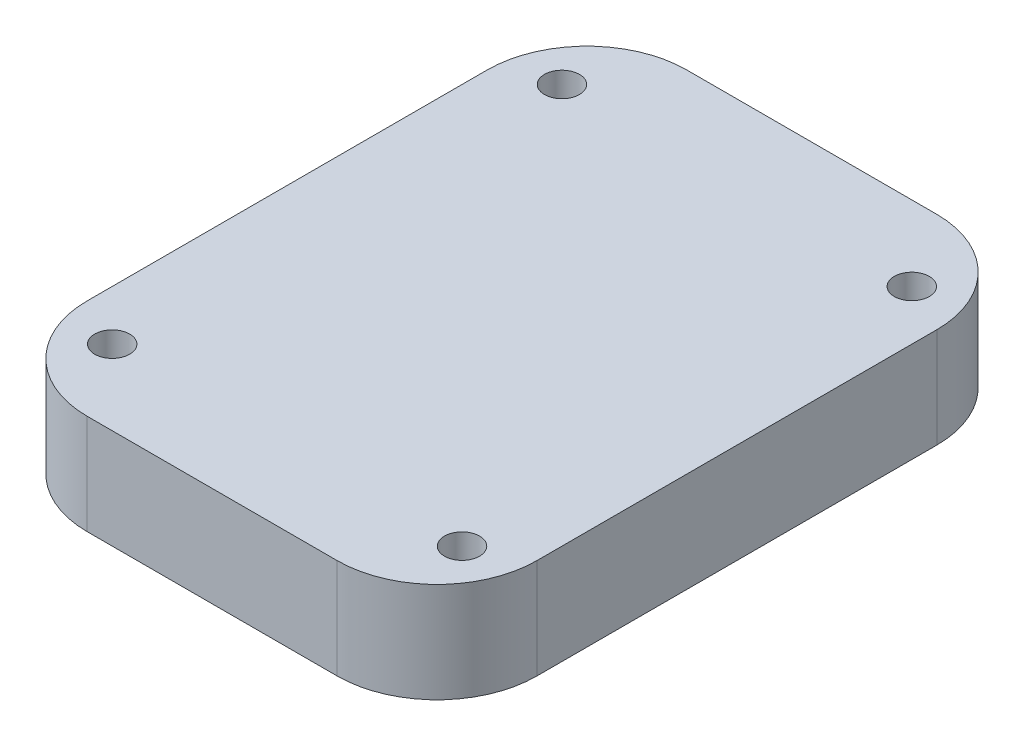
ISO-10303-21;
HEADER;
FILE_DESCRIPTION(('STEP AP214'),'2;1');
FILE_NAME('part.step','',(''),(''),'','','');
FILE_SCHEMA(('AUTOMOTIVE_DESIGN { 1 0 10303 214 1 1 1 1 }'));
ENDSEC;
DATA;
#1=APPLICATION_CONTEXT('core data for automotive mechanical design processes');
#2=APPLICATION_PROTOCOL_DEFINITION('international standard','automotive_design',2000,#1);
#3=PRODUCT_CONTEXT('',#1,'mechanical');
#4=PRODUCT('Part','Part','',(#3));
#5=PRODUCT_RELATED_PRODUCT_CATEGORY('part','',(#4));
#6=PRODUCT_DEFINITION_FORMATION('','',#4);
#7=PRODUCT_DEFINITION_CONTEXT('part definition',#1,'design');
#8=PRODUCT_DEFINITION('design','',#6,#7);
#9=PRODUCT_DEFINITION_SHAPE('','',#8);
#10=(LENGTH_UNIT() NAMED_UNIT(*) SI_UNIT(.MILLI.,.METRE.));
#11=(NAMED_UNIT(*) PLANE_ANGLE_UNIT() SI_UNIT($,.RADIAN.));
#12=(NAMED_UNIT(*) SI_UNIT($,.STERADIAN.) SOLID_ANGLE_UNIT());
#13=UNCERTAINTY_MEASURE_WITH_UNIT(LENGTH_MEASURE(1.E-05),#10,'distance_accuracy_value','');
#14=(GEOMETRIC_REPRESENTATION_CONTEXT(3) GLOBAL_UNCERTAINTY_ASSIGNED_CONTEXT((#13)) GLOBAL_UNIT_ASSIGNED_CONTEXT((#10,
#11,#12)) REPRESENTATION_CONTEXT('',''));
#15=CARTESIAN_POINT('',(0.,0.,0.));
#16=DIRECTION('',(0.,0.,1.));
#17=DIRECTION('',(1.,0.,0.));
#18=AXIS2_PLACEMENT_3D('',#15,#16,#17);
#19=CARTESIAN_POINT('',(-12.5,10.,-20.));
#20=DIRECTION('',(0.,-1.,0.));
#21=DIRECTION('',(0.,0.,-1.));
#22=AXIS2_PLACEMENT_3D('',#19,#20,#21);
#23=CYLINDRICAL_SURFACE('',#22,10.);
#24=CARTESIAN_POINT('',(-12.5,0.,-20.));
#25=DIRECTION('',(0.,1.,0.));
#26=DIRECTION('',(0.,0.,1.));
#27=AXIS2_PLACEMENT_3D('',#24,#25,#26);
#28=CIRCLE('',#27,10.);
#29=CARTESIAN_POINT('',(-12.4999999999999,0.,-30.));
#30=VERTEX_POINT('',#29);
#31=CARTESIAN_POINT('',(-22.5,0.,-19.9999999999999));
#32=VERTEX_POINT('',#31);
#33=EDGE_CURVE('E129',#30,#32,#28,.T.);
#34=ORIENTED_EDGE('',*,*,#33,.T.);
#35=DIRECTION('',(0.,-1.,0.));
#36=VECTOR('',#35,1.);
#37=CARTESIAN_POINT('',(-22.5,10.,-19.9999999999999));
#38=LINE('',#37,#36);
#39=CARTESIAN_POINT('',(-22.5,10.,-19.9999999999999));
#40=VERTEX_POINT('',#39);
#41=EDGE_CURVE('E11',#40,#32,#38,.T.);
#42=ORIENTED_EDGE('',*,*,#41,.F.);
#43=CARTESIAN_POINT('',(-12.5,10.,-20.));
#44=DIRECTION('',(0.,1.,0.));
#45=DIRECTION('',(0.,0.,1.));
#46=AXIS2_PLACEMENT_3D('',#43,#44,#45);
#47=CIRCLE('',#46,10.);
#48=CARTESIAN_POINT('',(-12.4999999999999,10.,-30.));
#49=VERTEX_POINT('',#48);
#50=EDGE_CURVE('E147',#49,#40,#47,.T.);
#51=ORIENTED_EDGE('',*,*,#50,.F.);
#52=DIRECTION('',(0.,-1.,0.));
#53=VECTOR('',#52,1.);
#54=CARTESIAN_POINT('',(-12.4999999999999,10.,-30.));
#55=LINE('',#54,#53);
#56=EDGE_CURVE('E49',#49,#30,#55,.T.);
#57=ORIENTED_EDGE('',*,*,#56,.T.);
#58=EDGE_LOOP('',(#34,#42,#51,#57));
#59=FACE_BOUND('',#58,.T.);
#60=ADVANCED_FACE('F33',(#59),#23,.T.);
#61=CARTESIAN_POINT('',(-22.5,10.,-19.9999999999999));
#62=DIRECTION('',(1.,0.,0.));
#63=DIRECTION('',(0.,0.,-1.));
#64=AXIS2_PLACEMENT_3D('',#61,#62,#63);
#65=PLANE('',#64);
#66=DIRECTION('',(0.,0.,1.));
#67=VECTOR('',#66,1.);
#68=CARTESIAN_POINT('',(-22.5,0.,-19.9999999999999));
#69=LINE('',#68,#67);
#70=CARTESIAN_POINT('',(-22.5,0.,19.9999999999999));
#71=VERTEX_POINT('',#70);
#72=EDGE_CURVE('E131',#32,#71,#69,.T.);
#73=ORIENTED_EDGE('',*,*,#72,.T.);
#74=DIRECTION('',(0.,-1.,0.));
#75=VECTOR('',#74,1.);
#76=CARTESIAN_POINT('',(-22.5,10.,19.9999999999999));
#77=LINE('',#76,#75);
#78=CARTESIAN_POINT('',(-22.5,10.,19.9999999999999));
#79=VERTEX_POINT('',#78);
#80=EDGE_CURVE('E41',#79,#71,#77,.T.);
#81=ORIENTED_EDGE('',*,*,#80,.F.);
#82=DIRECTION('',(0.,0.,1.));
#83=VECTOR('',#82,1.);
#84=CARTESIAN_POINT('',(-22.5,10.,-19.9999999999999));
#85=LINE('',#84,#83);
#86=EDGE_CURVE('E87',#40,#79,#85,.T.);
#87=ORIENTED_EDGE('',*,*,#86,.F.);
#88=ORIENTED_EDGE('',*,*,#41,.T.);
#89=EDGE_LOOP('',(#73,#81,#87,#88));
#90=FACE_BOUND('',#89,.T.);
#91=ADVANCED_FACE('F232',(#90),#65,.F.);
#92=CARTESIAN_POINT('',(-12.5,10.,20.));
#93=DIRECTION('',(0.,-1.,0.));
#94=DIRECTION('',(0.,0.,-1.));
#95=AXIS2_PLACEMENT_3D('',#92,#93,#94);
#96=CYLINDRICAL_SURFACE('',#95,10.);
#97=CARTESIAN_POINT('',(-12.5,0.,20.));
#98=DIRECTION('',(0.,1.,0.));
#99=DIRECTION('',(0.,0.,1.));
#100=AXIS2_PLACEMENT_3D('',#97,#98,#99);
#101=CIRCLE('',#100,10.);
#102=CARTESIAN_POINT('',(-12.5,0.,30.));
#103=VERTEX_POINT('',#102);
#104=EDGE_CURVE('E134',#71,#103,#101,.T.);
#105=ORIENTED_EDGE('',*,*,#104,.T.);
#106=DIRECTION('',(0.,-1.,0.));
#107=VECTOR('',#106,1.);
#108=CARTESIAN_POINT('',(-12.5,10.,30.));
#109=LINE('',#108,#107);
#110=CARTESIAN_POINT('',(-12.5,10.,30.));
#111=VERTEX_POINT('',#110);
#112=EDGE_CURVE('E154',#111,#103,#109,.T.);
#113=ORIENTED_EDGE('',*,*,#112,.F.);
#114=CARTESIAN_POINT('',(-12.5,10.,20.));
#115=DIRECTION('',(0.,1.,0.));
#116=DIRECTION('',(0.,0.,1.));
#117=AXIS2_PLACEMENT_3D('',#114,#115,#116);
#118=CIRCLE('',#117,10.);
#119=EDGE_CURVE('E162',#79,#111,#118,.T.);
#120=ORIENTED_EDGE('',*,*,#119,.F.);
#121=ORIENTED_EDGE('',*,*,#80,.T.);
#122=EDGE_LOOP('',(#105,#113,#120,#121));
#123=FACE_BOUND('',#122,.T.);
#124=ADVANCED_FACE('F160',(#123),#96,.T.);
#125=CARTESIAN_POINT('',(-12.4999999999999,10.,30.));
#126=DIRECTION('',(0.,0.,-1.));
#127=DIRECTION('',(-1.,0.,0.));
#128=AXIS2_PLACEMENT_3D('',#125,#126,#127);
#129=PLANE('',#128);
#130=DIRECTION('',(1.,0.,0.));
#131=VECTOR('',#130,1.);
#132=CARTESIAN_POINT('',(-12.4999999999999,0.,30.));
#133=LINE('',#132,#131);
#134=CARTESIAN_POINT('',(12.4999999999999,0.,30.));
#135=VERTEX_POINT('',#134);
#136=EDGE_CURVE('E136',#103,#135,#133,.T.);
#137=ORIENTED_EDGE('',*,*,#136,.T.);
#138=DIRECTION('',(0.,-1.,0.));
#139=VECTOR('',#138,1.);
#140=CARTESIAN_POINT('',(12.4999999999999,10.,30.));
#141=LINE('',#140,#139);
#142=CARTESIAN_POINT('',(12.4999999999999,10.,30.));
#143=VERTEX_POINT('',#142);
#144=EDGE_CURVE('E151',#143,#135,#141,.T.);
#145=ORIENTED_EDGE('',*,*,#144,.F.);
#146=DIRECTION('',(1.,0.,0.));
#147=VECTOR('',#146,1.);
#148=CARTESIAN_POINT('',(-12.4999999999999,10.,30.));
#149=LINE('',#148,#147);
#150=EDGE_CURVE('E173',#111,#143,#149,.T.);
#151=ORIENTED_EDGE('',*,*,#150,.F.);
#152=ORIENTED_EDGE('',*,*,#112,.T.);
#153=EDGE_LOOP('',(#137,#145,#151,#152));
#154=FACE_BOUND('',#153,.T.);
#155=ADVANCED_FACE('F169',(#154),#129,.F.);
#156=CARTESIAN_POINT('',(12.5,10.,20.));
#157=DIRECTION('',(0.,-1.,0.));
#158=DIRECTION('',(0.,0.,-1.));
#159=AXIS2_PLACEMENT_3D('',#156,#157,#158);
#160=CYLINDRICAL_SURFACE('',#159,10.);
#161=CARTESIAN_POINT('',(12.5,0.,20.));
#162=DIRECTION('',(0.,1.,0.));
#163=DIRECTION('',(0.,0.,1.));
#164=AXIS2_PLACEMENT_3D('',#161,#162,#163);
#165=CIRCLE('',#164,10.);
#166=CARTESIAN_POINT('',(22.5,0.,19.9999999999999));
#167=VERTEX_POINT('',#166);
#168=EDGE_CURVE('E138',#135,#167,#165,.T.);
#169=ORIENTED_EDGE('',*,*,#168,.T.);
#170=DIRECTION('',(0.,-1.,0.));
#171=VECTOR('',#170,1.);
#172=CARTESIAN_POINT('',(22.5,10.,19.9999999999999));
#173=LINE('',#172,#171);
#174=CARTESIAN_POINT('',(22.5,10.,19.9999999999999));
#175=VERTEX_POINT('',#174);
#176=EDGE_CURVE('E112',#175,#167,#173,.T.);
#177=ORIENTED_EDGE('',*,*,#176,.F.);
#178=CARTESIAN_POINT('',(12.5,10.,20.));
#179=DIRECTION('',(0.,1.,0.));
#180=DIRECTION('',(0.,0.,1.));
#181=AXIS2_PLACEMENT_3D('',#178,#179,#180);
#182=CIRCLE('',#181,10.);
#183=EDGE_CURVE('E120',#143,#175,#182,.T.);
#184=ORIENTED_EDGE('',*,*,#183,.F.);
#185=ORIENTED_EDGE('',*,*,#144,.T.);
#186=EDGE_LOOP('',(#169,#177,#184,#185));
#187=FACE_BOUND('',#186,.T.);
#188=ADVANCED_FACE('F172',(#187),#160,.T.);
#189=CARTESIAN_POINT('',(22.5,10.,-19.9999999999999));
#190=DIRECTION('',(1.,0.,0.));
#191=DIRECTION('',(0.,0.,-1.));
#192=AXIS2_PLACEMENT_3D('',#189,#190,#191);
#193=PLANE('',#192);
#194=DIRECTION('',(0.,0.,1.));
#195=VECTOR('',#194,1.);
#196=CARTESIAN_POINT('',(22.5,0.,-19.9999999999999));
#197=LINE('',#196,#195);
#198=CARTESIAN_POINT('',(22.5,0.,-19.9999999999999));
#199=VERTEX_POINT('',#198);
#200=EDGE_CURVE('E108',#199,#167,#197,.T.);
#201=ORIENTED_EDGE('',*,*,#200,.F.);
#202=DIRECTION('',(0.,-1.,0.));
#203=VECTOR('',#202,1.);
#204=CARTESIAN_POINT('',(22.5,10.,-19.9999999999999));
#205=LINE('',#204,#203);
#206=CARTESIAN_POINT('',(22.5,10.,-19.9999999999999));
#207=VERTEX_POINT('',#206);
#208=EDGE_CURVE('E103',#207,#199,#205,.T.);
#209=ORIENTED_EDGE('',*,*,#208,.F.);
#210=DIRECTION('',(0.,0.,1.));
#211=VECTOR('',#210,1.);
#212=CARTESIAN_POINT('',(22.5,10.,-19.9999999999999));
#213=LINE('',#212,#211);
#214=EDGE_CURVE('E106',#207,#175,#213,.T.);
#215=ORIENTED_EDGE('',*,*,#214,.T.);
#216=ORIENTED_EDGE('',*,*,#176,.T.);
#217=EDGE_LOOP('',(#201,#209,#215,#216));
#218=FACE_BOUND('',#217,.T.);
#219=ADVANCED_FACE('F105',(#218),#193,.T.);
#220=CARTESIAN_POINT('',(12.5,10.,-20.));
#221=DIRECTION('',(0.,-1.,0.));
#222=DIRECTION('',(0.,0.,-1.));
#223=AXIS2_PLACEMENT_3D('',#220,#221,#222);
#224=CYLINDRICAL_SURFACE('',#223,10.);
#225=CARTESIAN_POINT('',(12.5,0.,-20.));
#226=DIRECTION('',(0.,-1.,0.));
#227=DIRECTION('',(0.,0.,-1.));
#228=AXIS2_PLACEMENT_3D('',#225,#226,#227);
#229=CIRCLE('',#228,10.);
#230=CARTESIAN_POINT('',(12.4999999999999,0.,-30.));
#231=VERTEX_POINT('',#230);
#232=EDGE_CURVE('E142',#231,#199,#229,.T.);
#233=ORIENTED_EDGE('',*,*,#232,.F.);
#234=DIRECTION('',(0.,-1.,0.));
#235=VECTOR('',#234,1.);
#236=CARTESIAN_POINT('',(12.4999999999999,10.,-30.));
#237=LINE('',#236,#235);
#238=CARTESIAN_POINT('',(12.4999999999999,10.,-30.));
#239=VERTEX_POINT('',#238);
#240=EDGE_CURVE('E75',#239,#231,#237,.T.);
#241=ORIENTED_EDGE('',*,*,#240,.F.);
#242=CARTESIAN_POINT('',(12.5,10.,-20.));
#243=DIRECTION('',(0.,-1.,0.));
#244=DIRECTION('',(0.,0.,-1.));
#245=AXIS2_PLACEMENT_3D('',#242,#243,#244);
#246=CIRCLE('',#245,10.);
#247=EDGE_CURVE('E118',#239,#207,#246,.T.);
#248=ORIENTED_EDGE('',*,*,#247,.T.);
#249=ORIENTED_EDGE('',*,*,#208,.T.);
#250=EDGE_LOOP('',(#233,#241,#248,#249));
#251=FACE_BOUND('',#250,.T.);
#252=ADVANCED_FACE('F123',(#251),#224,.T.);
#253=CARTESIAN_POINT('',(-12.4999999999999,10.,-30.));
#254=DIRECTION('',(0.,0.,-1.));
#255=DIRECTION('',(-1.,0.,0.));
#256=AXIS2_PLACEMENT_3D('',#253,#254,#255);
#257=PLANE('',#256);
#258=DIRECTION('',(1.,0.,0.));
#259=VECTOR('',#258,1.);
#260=CARTESIAN_POINT('',(-12.4999999999999,0.,-30.));
#261=LINE('',#260,#259);
#262=EDGE_CURVE('E144',#30,#231,#261,.T.);
#263=ORIENTED_EDGE('',*,*,#262,.F.);
#264=ORIENTED_EDGE('',*,*,#56,.F.);
#265=DIRECTION('',(1.,0.,0.));
#266=VECTOR('',#265,1.);
#267=CARTESIAN_POINT('',(-12.4999999999999,10.,-30.));
#268=LINE('',#267,#266);
#269=EDGE_CURVE('E124',#49,#239,#268,.T.);
#270=ORIENTED_EDGE('',*,*,#269,.T.);
#271=ORIENTED_EDGE('',*,*,#240,.T.);
#272=EDGE_LOOP('',(#263,#264,#270,#271));
#273=FACE_BOUND('',#272,.T.);
#274=ADVANCED_FACE('F215',(#273),#257,.T.);
#275=CARTESIAN_POINT('',(-12.5,10.,-20.));
#276=DIRECTION('',(0.,1.,0.));
#277=DIRECTION('',(0.,0.,1.));
#278=AXIS2_PLACEMENT_3D('',#275,#276,#277);
#279=PLANE('',#278);
#280=CARTESIAN_POINT('',(-17.5,10.,22.5));
#281=DIRECTION('',(0.,1.,0.));
#282=DIRECTION('',(0.,0.,1.));
#283=AXIS2_PLACEMENT_3D('',#280,#281,#282);
#284=CIRCLE('',#283,1.75);
#285=CARTESIAN_POINT('',(-17.5,10.,24.25));
#286=VERTEX_POINT('',#285);
#287=EDGE_CURVE('E185',#286,#286,#284,.T.);
#288=ORIENTED_EDGE('',*,*,#287,.F.);
#289=EDGE_LOOP('',(#288));
#290=FACE_BOUND('',#289,.T.);
#291=CARTESIAN_POINT('',(17.5,10.,22.5));
#292=DIRECTION('',(0.,1.,0.));
#293=DIRECTION('',(0.,0.,1.));
#294=AXIS2_PLACEMENT_3D('',#291,#292,#293);
#295=CIRCLE('',#294,1.75);
#296=CARTESIAN_POINT('',(17.5,10.,24.25));
#297=VERTEX_POINT('',#296);
#298=EDGE_CURVE('E191',#297,#297,#295,.T.);
#299=ORIENTED_EDGE('',*,*,#298,.F.);
#300=EDGE_LOOP('',(#299));
#301=FACE_BOUND('',#300,.T.);
#302=CARTESIAN_POINT('',(17.5,10.,-22.5));
#303=DIRECTION('',(0.,1.,0.));
#304=DIRECTION('',(0.,0.,1.));
#305=AXIS2_PLACEMENT_3D('',#302,#303,#304);
#306=CIRCLE('',#305,1.75);
#307=CARTESIAN_POINT('',(17.5,10.,-20.75));
#308=VERTEX_POINT('',#307);
#309=EDGE_CURVE('E197',#308,#308,#306,.T.);
#310=ORIENTED_EDGE('',*,*,#309,.F.);
#311=EDGE_LOOP('',(#310));
#312=FACE_BOUND('',#311,.T.);
#313=CARTESIAN_POINT('',(-17.5,10.,-22.5));
#314=DIRECTION('',(0.,1.,0.));
#315=DIRECTION('',(0.,0.,1.));
#316=AXIS2_PLACEMENT_3D('',#313,#314,#315);
#317=CIRCLE('',#316,1.75);
#318=CARTESIAN_POINT('',(-17.5,10.,-20.75));
#319=VERTEX_POINT('',#318);
#320=EDGE_CURVE('E179',#319,#319,#317,.T.);
#321=ORIENTED_EDGE('',*,*,#320,.F.);
#322=EDGE_LOOP('',(#321));
#323=FACE_BOUND('',#322,.T.);
#324=ORIENTED_EDGE('',*,*,#50,.T.);
#325=ORIENTED_EDGE('',*,*,#86,.T.);
#326=ORIENTED_EDGE('',*,*,#119,.T.);
#327=ORIENTED_EDGE('',*,*,#150,.T.);
#328=ORIENTED_EDGE('',*,*,#183,.T.);
#329=ORIENTED_EDGE('',*,*,#214,.F.);
#330=ORIENTED_EDGE('',*,*,#247,.F.);
#331=ORIENTED_EDGE('',*,*,#269,.F.);
#332=EDGE_LOOP('',(#324,#325,#326,#327,#328,#329,#330,#331));
#333=FACE_BOUND('',#332,.T.);
#334=ADVANCED_FACE('F116',(#290,#301,#312,#323,#333),#279,.T.);
#335=CARTESIAN_POINT('',(-12.5,0.,-20.));
#336=DIRECTION('',(0.,1.,0.));
#337=DIRECTION('',(0.,0.,1.));
#338=AXIS2_PLACEMENT_3D('',#335,#336,#337);
#339=PLANE('',#338);
#340=CARTESIAN_POINT('',(-17.5,0.,22.5));
#341=DIRECTION('',(0.,1.,0.));
#342=DIRECTION('',(0.,0.,1.));
#343=AXIS2_PLACEMENT_3D('',#340,#341,#342);
#344=CIRCLE('',#343,1.75);
#345=CARTESIAN_POINT('',(-17.5,0.,24.25));
#346=VERTEX_POINT('',#345);
#347=EDGE_CURVE('E188',#346,#346,#344,.T.);
#348=ORIENTED_EDGE('',*,*,#347,.T.);
#349=EDGE_LOOP('',(#348));
#350=FACE_BOUND('',#349,.T.);
#351=CARTESIAN_POINT('',(17.5,0.,22.5));
#352=DIRECTION('',(0.,1.,0.));
#353=DIRECTION('',(0.,0.,1.));
#354=AXIS2_PLACEMENT_3D('',#351,#352,#353);
#355=CIRCLE('',#354,1.75);
#356=CARTESIAN_POINT('',(17.5,0.,24.25));
#357=VERTEX_POINT('',#356);
#358=EDGE_CURVE('E194',#357,#357,#355,.T.);
#359=ORIENTED_EDGE('',*,*,#358,.T.);
#360=EDGE_LOOP('',(#359));
#361=FACE_BOUND('',#360,.T.);
#362=CARTESIAN_POINT('',(17.5,0.,-22.5));
#363=DIRECTION('',(0.,1.,0.));
#364=DIRECTION('',(0.,0.,1.));
#365=AXIS2_PLACEMENT_3D('',#362,#363,#364);
#366=CIRCLE('',#365,1.75);
#367=CARTESIAN_POINT('',(17.5,0.,-20.75));
#368=VERTEX_POINT('',#367);
#369=EDGE_CURVE('E182',#368,#368,#366,.T.);
#370=ORIENTED_EDGE('',*,*,#369,.T.);
#371=EDGE_LOOP('',(#370));
#372=FACE_BOUND('',#371,.T.);
#373=CARTESIAN_POINT('',(-17.5,0.,-22.5));
#374=DIRECTION('',(0.,1.,0.));
#375=DIRECTION('',(0.,0.,1.));
#376=AXIS2_PLACEMENT_3D('',#373,#374,#375);
#377=CIRCLE('',#376,1.75);
#378=CARTESIAN_POINT('',(-17.5,0.,-20.75));
#379=VERTEX_POINT('',#378);
#380=EDGE_CURVE('E132',#379,#379,#377,.T.);
#381=ORIENTED_EDGE('',*,*,#380,.T.);
#382=EDGE_LOOP('',(#381));
#383=FACE_BOUND('',#382,.T.);
#384=ORIENTED_EDGE('',*,*,#33,.F.);
#385=ORIENTED_EDGE('',*,*,#262,.T.);
#386=ORIENTED_EDGE('',*,*,#232,.T.);
#387=ORIENTED_EDGE('',*,*,#200,.T.);
#388=ORIENTED_EDGE('',*,*,#168,.F.);
#389=ORIENTED_EDGE('',*,*,#136,.F.);
#390=ORIENTED_EDGE('',*,*,#104,.F.);
#391=ORIENTED_EDGE('',*,*,#72,.F.);
#392=EDGE_LOOP('',(#384,#385,#386,#387,#388,#389,#390,#391));
#393=FACE_BOUND('',#392,.T.);
#394=ADVANCED_FACE('F165',(#350,#361,#372,#383,#393),#339,.F.);
#395=CARTESIAN_POINT('',(-17.5,0.,-22.5));
#396=DIRECTION('',(0.,1.,0.));
#397=DIRECTION('',(0.,0.,1.));
#398=AXIS2_PLACEMENT_3D('',#395,#396,#397);
#399=CYLINDRICAL_SURFACE('',#398,1.75);
#400=ORIENTED_EDGE('',*,*,#380,.F.);
#401=EDGE_LOOP('',(#400));
#402=FACE_BOUND('',#401,.T.);
#403=ORIENTED_EDGE('',*,*,#320,.T.);
#404=EDGE_LOOP('',(#403));
#405=FACE_BOUND('',#404,.T.);
#406=ADVANCED_FACE('F209',(#402,#405),#399,.F.);
#407=CARTESIAN_POINT('',(17.5,0.,-22.5));
#408=DIRECTION('',(0.,1.,0.));
#409=DIRECTION('',(0.,0.,1.));
#410=AXIS2_PLACEMENT_3D('',#407,#408,#409);
#411=CYLINDRICAL_SURFACE('',#410,1.75);
#412=ORIENTED_EDGE('',*,*,#369,.F.);
#413=EDGE_LOOP('',(#412));
#414=FACE_BOUND('',#413,.T.);
#415=ORIENTED_EDGE('',*,*,#309,.T.);
#416=EDGE_LOOP('',(#415));
#417=FACE_BOUND('',#416,.T.);
#418=ADVANCED_FACE('F205',(#414,#417),#411,.F.);
#419=CARTESIAN_POINT('',(17.5,0.,22.5));
#420=DIRECTION('',(0.,1.,0.));
#421=DIRECTION('',(0.,0.,1.));
#422=AXIS2_PLACEMENT_3D('',#419,#420,#421);
#423=CYLINDRICAL_SURFACE('',#422,1.75);
#424=ORIENTED_EDGE('',*,*,#358,.F.);
#425=EDGE_LOOP('',(#424));
#426=FACE_BOUND('',#425,.T.);
#427=ORIENTED_EDGE('',*,*,#298,.T.);
#428=EDGE_LOOP('',(#427));
#429=FACE_BOUND('',#428,.T.);
#430=ADVANCED_FACE('F208',(#426,#429),#423,.F.);
#431=CARTESIAN_POINT('',(-17.5,0.,22.5));
#432=DIRECTION('',(0.,1.,0.));
#433=DIRECTION('',(0.,0.,1.));
#434=AXIS2_PLACEMENT_3D('',#431,#432,#433);
#435=CYLINDRICAL_SURFACE('',#434,1.75);
#436=ORIENTED_EDGE('',*,*,#347,.F.);
#437=EDGE_LOOP('',(#436));
#438=FACE_BOUND('',#437,.T.);
#439=ORIENTED_EDGE('',*,*,#287,.T.);
#440=EDGE_LOOP('',(#439));
#441=FACE_BOUND('',#440,.T.);
#442=ADVANCED_FACE('F301',(#438,#441),#435,.F.);
#443=CLOSED_SHELL('',(#60,#91,#124,#155,#188,#219,#252,#274,#334,#394,#406,#418,#430,#442));
#444=MANIFOLD_SOLID_BREP('B2',#443);
#445=ADVANCED_BREP_SHAPE_REPRESENTATION('',(#18,#444),#14);
#446=SHAPE_DEFINITION_REPRESENTATION(#9,#445);
ENDSEC;
END-ISO-10303-21;
